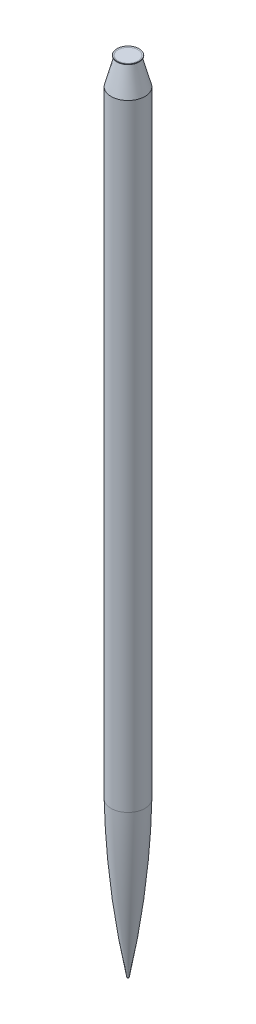
ISO-10303-21;
HEADER;
FILE_DESCRIPTION(('STEP AP214'),'2;1');
FILE_NAME('part.step','',(''),(''),'','','');
FILE_SCHEMA(('AUTOMOTIVE_DESIGN { 1 0 10303 214 1 1 1 1 }'));
ENDSEC;
DATA;
#1=APPLICATION_CONTEXT('core data for automotive mechanical design processes');
#2=APPLICATION_PROTOCOL_DEFINITION('international standard','automotive_design',2000,#1);
#3=PRODUCT_CONTEXT('',#1,'mechanical');
#4=PRODUCT('Part','Part','',(#3));
#5=PRODUCT_RELATED_PRODUCT_CATEGORY('part','',(#4));
#6=PRODUCT_DEFINITION_FORMATION('','',#4);
#7=PRODUCT_DEFINITION_CONTEXT('part definition',#1,'design');
#8=PRODUCT_DEFINITION('design','',#6,#7);
#9=PRODUCT_DEFINITION_SHAPE('','',#8);
#10=(LENGTH_UNIT() NAMED_UNIT(*) SI_UNIT(.MILLI.,.METRE.));
#11=(NAMED_UNIT(*) PLANE_ANGLE_UNIT() SI_UNIT($,.RADIAN.));
#12=(NAMED_UNIT(*) SI_UNIT($,.STERADIAN.) SOLID_ANGLE_UNIT());
#13=UNCERTAINTY_MEASURE_WITH_UNIT(LENGTH_MEASURE(1.E-05),#10,'distance_accuracy_value','');
#14=(GEOMETRIC_REPRESENTATION_CONTEXT(3) GLOBAL_UNCERTAINTY_ASSIGNED_CONTEXT((#13)) GLOBAL_UNIT_ASSIGNED_CONTEXT((#10,
#11,#12)) REPRESENTATION_CONTEXT('',''));
#15=CARTESIAN_POINT('',(0.,0.,0.));
#16=DIRECTION('',(0.,0.,1.));
#17=DIRECTION('',(1.,0.,0.));
#18=AXIS2_PLACEMENT_3D('',#15,#16,#17);
#19=CARTESIAN_POINT('',(0.,298.198587557185,0.));
#20=DIRECTION('',(0.,-1.,0.));
#21=DIRECTION('',(0.,0.,-1.));
#22=AXIS2_PLACEMENT_3D('',#19,#20,#21);
#23=DEGENERATE_TOROIDAL_SURFACE('',#22,1526.98630276103,1555.83082834892,.F.);
#24=CARTESIAN_POINT('',(0.,8.03485856842852,0.));
#25=DIRECTION('',(0.,-1.,0.));
#26=DIRECTION('',(0.,0.,-1.));
#27=AXIS2_PLACEMENT_3D('',#24,#25,#26);
#28=CIRCLE('',#27,1.5471698264169);
#29=CARTESIAN_POINT('',(0.,8.03485856842852,-1.5471698264169));
#30=VERTEX_POINT('',#29);
#31=EDGE_CURVE('E50',#30,#30,#28,.T.);
#32=ORIENTED_EDGE('',*,*,#31,.F.);
#33=EDGE_LOOP('',(#32));
#34=FACE_BOUND('',#33,.T.);
#35=CARTESIAN_POINT('',(0.,269.24,0.));
#36=DIRECTION('',(0.,-1.,0.));
#37=DIRECTION('',(0.,0.,-1.));
#38=AXIS2_PLACEMENT_3D('',#35,#36,#37);
#39=CIRCLE('',#38,28.575);
#40=CARTESIAN_POINT('',(0.,269.24,-28.575));
#41=VERTEX_POINT('',#40);
#42=EDGE_CURVE('E10',#41,#41,#39,.T.);
#43=ORIENTED_EDGE('',*,*,#42,.T.);
#44=EDGE_LOOP('',(#43));
#45=FACE_BOUND('',#44,.T.);
#46=ADVANCED_FACE('F43',(#34,#45),#23,.F.);
#47=CARTESIAN_POINT('',(0.,0.,0.));
#48=DIRECTION('',(0.,-1.,0.));
#49=DIRECTION('',(0.,0.,-1.));
#50=AXIS2_PLACEMENT_3D('',#47,#48,#49);
#51=CYLINDRICAL_SURFACE('',#50,28.575);
#52=ORIENTED_EDGE('',*,*,#42,.F.);
#53=EDGE_LOOP('',(#52));
#54=FACE_BOUND('',#53,.T.);
#55=CARTESIAN_POINT('',(0.,1312.926,0.));
#56=DIRECTION('',(0.,1.,0.));
#57=DIRECTION('',(0.,0.,1.));
#58=AXIS2_PLACEMENT_3D('',#55,#56,#57);
#59=CIRCLE('',#58,28.575);
#60=CARTESIAN_POINT('',(0.,1312.926,28.575));
#61=VERTEX_POINT('',#60);
#62=EDGE_CURVE('E60',#61,#61,#59,.T.);
#63=ORIENTED_EDGE('',*,*,#62,.F.);
#64=EDGE_LOOP('',(#63));
#65=FACE_BOUND('',#64,.T.);
#66=ADVANCED_FACE('F100',(#54,#65),#51,.T.);
#67=CARTESIAN_POINT('',(0.,8.32856006353028,0.));
#68=DIRECTION('',(0.,-1.,0.));
#69=DIRECTION('',(-1.,0.,0.));
#70=AXIS2_PLACEMENT_3D('',#67,#68,#69);
#71=SPHERICAL_SURFACE('',#70,1.57479999999997);
#72=ORIENTED_EDGE('',*,*,#31,.T.);
#73=EDGE_LOOP('',(#72));
#74=FACE_BOUND('',#73,.T.);
#75=ADVANCED_FACE('F95',(#74),#71,.T.);
#76=CARTESIAN_POINT('',(0.,1312.926,0.));
#77=DIRECTION('',(0.,-1.,0.));
#78=DIRECTION('',(0.,0.,-1.));
#79=AXIS2_PLACEMENT_3D('',#76,#77,#78);
#80=CONICAL_SURFACE('',#79,28.575,0.26179938779915);
#81=CARTESIAN_POINT('',(0.,1357.31457048154,0.));
#82=DIRECTION('',(0.,1.,0.));
#83=DIRECTION('',(0.,0.,1.));
#84=AXIS2_PLACEMENT_3D('',#81,#82,#83);
#85=CIRCLE('',#84,16.6811183862992);
#86=CARTESIAN_POINT('',(0.,1357.31457048154,16.6811183862992));
#87=VERTEX_POINT('',#86);
#88=EDGE_CURVE('E55',#87,#87,#85,.T.);
#89=ORIENTED_EDGE('',*,*,#88,.F.);
#90=EDGE_LOOP('',(#89));
#91=FACE_BOUND('',#90,.T.);
#92=ORIENTED_EDGE('',*,*,#62,.T.);
#93=EDGE_LOOP('',(#92));
#94=FACE_BOUND('',#93,.T.);
#95=ADVANCED_FACE('F88',(#91,#94),#80,.T.);
#96=CARTESIAN_POINT('',(0.,1357.51179059391,0.));
#97=DIRECTION('',(0.,1.,0.));
#98=DIRECTION('',(0.,0.,1.));
#99=AXIS2_PLACEMENT_3D('',#96,#97,#98);
#100=TOROIDAL_SURFACE('',#99,17.4171538659314,0.76199999999995);
#101=CARTESIAN_POINT('',(0.,1358.24782607354,0.));
#102=DIRECTION('',(0.,1.,0.));
#103=DIRECTION('',(0.,0.,1.));
#104=AXIS2_PLACEMENT_3D('',#101,#102,#103);
#105=CIRCLE('',#104,17.2199337535632);
#106=CARTESIAN_POINT('',(0.,1358.24782607354,17.2199337535632));
#107=VERTEX_POINT('',#106);
#108=EDGE_CURVE('E78',#107,#107,#105,.T.);
#109=ORIENTED_EDGE('',*,*,#108,.F.);
#110=EDGE_LOOP('',(#109));
#111=FACE_BOUND('',#110,.T.);
#112=ORIENTED_EDGE('',*,*,#88,.T.);
#113=EDGE_LOOP('',(#112));
#114=FACE_BOUND('',#113,.T.);
#115=ADVANCED_FACE('F85',(#111,#114),#100,.F.);
#116=CARTESIAN_POINT('',(0.,1358.24782607354,0.));
#117=DIRECTION('',(0.,1.,0.));
#118=DIRECTION('',(0.,0.,1.));
#119=AXIS2_PLACEMENT_3D('',#116,#117,#118);
#120=CONICAL_SURFACE('',#119,17.2199337535632,1.30899693899577);
#121=CARTESIAN_POINT('',(0.,1358.69070867289,0.));
#122=DIRECTION('',(0.,1.,0.));
#123=DIRECTION('',(0.,0.,1.));
#124=AXIS2_PLACEMENT_3D('',#121,#122,#123);
#125=CIRCLE('',#124,18.8727941161137);
#126=CARTESIAN_POINT('',(0.,1358.69070867289,18.8727941161137));
#127=VERTEX_POINT('',#126);
#128=EDGE_CURVE('E74',#127,#127,#125,.T.);
#129=ORIENTED_EDGE('',*,*,#128,.F.);
#130=EDGE_LOOP('',(#129));
#131=FACE_BOUND('',#130,.T.);
#132=ORIENTED_EDGE('',*,*,#108,.T.);
#133=EDGE_LOOP('',(#132));
#134=FACE_BOUND('',#133,.T.);
#135=ADVANCED_FACE('F83',(#131,#134),#120,.T.);
#136=CARTESIAN_POINT('',(0.,1358.69070867289,0.));
#137=DIRECTION('',(0.,-1.,0.));
#138=DIRECTION('',(0.,0.,-1.));
#139=AXIS2_PLACEMENT_3D('',#136,#137,#138);
#140=CONICAL_SURFACE('',#139,18.8727941161137,0.261799387799164);
#141=CARTESIAN_POINT('',(0.,1359.45127866851,0.));
#142=DIRECTION('',(0.,1.,0.));
#143=DIRECTION('',(0.,0.,1.));
#144=AXIS2_PLACEMENT_3D('',#141,#142,#143);
#145=CIRCLE('',#144,18.669);
#146=CARTESIAN_POINT('',(0.,1359.45127866851,18.669));
#147=VERTEX_POINT('',#146);
#148=EDGE_CURVE('E70',#147,#147,#145,.T.);
#149=ORIENTED_EDGE('',*,*,#148,.F.);
#150=EDGE_LOOP('',(#149));
#151=FACE_BOUND('',#150,.T.);
#152=ORIENTED_EDGE('',*,*,#128,.T.);
#153=EDGE_LOOP('',(#152));
#154=FACE_BOUND('',#153,.T.);
#155=ADVANCED_FACE('F90',(#151,#154),#140,.T.);
#156=CARTESIAN_POINT('',(0.,1359.45127866851,0.));
#157=DIRECTION('',(0.,1.,0.));
#158=DIRECTION('',(0.,0.,1.));
#159=AXIS2_PLACEMENT_3D('',#156,#157,#158);
#160=CONICAL_SURFACE('',#159,18.669,1.30899693899575);
#161=CARTESIAN_POINT('',(0.,1358.9,0.));
#162=DIRECTION('',(0.,1.,0.));
#163=DIRECTION('',(0.,0.,1.));
#164=AXIS2_PLACEMENT_3D('',#161,#162,#163);
#165=CIRCLE('',#164,16.6116);
#166=CARTESIAN_POINT('',(0.,1358.9,16.6116));
#167=VERTEX_POINT('',#166);
#168=EDGE_CURVE('E66',#167,#167,#165,.T.);
#169=ORIENTED_EDGE('',*,*,#168,.F.);
#170=EDGE_LOOP('',(#169));
#171=FACE_BOUND('',#170,.T.);
#172=ORIENTED_EDGE('',*,*,#148,.T.);
#173=EDGE_LOOP('',(#172));
#174=FACE_BOUND('',#173,.T.);
#175=ADVANCED_FACE('F112',(#171,#174),#160,.F.);
#176=CARTESIAN_POINT('',(0.,1358.9,0.));
#177=DIRECTION('',(0.,-1.,0.));
#178=DIRECTION('',(0.,0.,-1.));
#179=AXIS2_PLACEMENT_3D('',#176,#177,#178);
#180=PLANE('',#179);
#181=ORIENTED_EDGE('',*,*,#168,.T.);
#182=EDGE_LOOP('',(#181));
#183=FACE_BOUND('',#182,.T.);
#184=ADVANCED_FACE('F97',(#183),#180,.F.);
#185=CLOSED_SHELL('',(#46,#66,#75,#95,#115,#135,#155,#175,#184));
#186=MANIFOLD_SOLID_BREP('B2',#185);
#187=ADVANCED_BREP_SHAPE_REPRESENTATION('',(#18,#186),#14);
#188=SHAPE_DEFINITION_REPRESENTATION(#9,#187);
ENDSEC;
END-ISO-10303-21;
